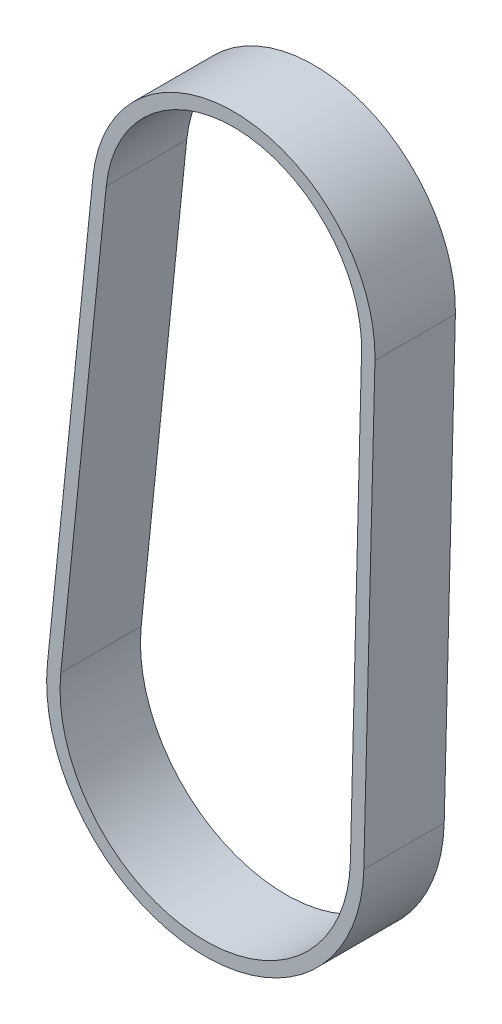
ISO-10303-21;
HEADER;
FILE_DESCRIPTION(('STEP AP214'),'2;1');
FILE_NAME('part.step','',(''),(''),'','','');
FILE_SCHEMA(('AUTOMOTIVE_DESIGN { 1 0 10303 214 1 1 1 1 }'));
ENDSEC;
DATA;
#1=APPLICATION_CONTEXT('core data for automotive mechanical design processes');
#2=APPLICATION_PROTOCOL_DEFINITION('international standard','automotive_design',2000,#1);
#3=PRODUCT_CONTEXT('',#1,'mechanical');
#4=PRODUCT('Part','Part','',(#3));
#5=PRODUCT_RELATED_PRODUCT_CATEGORY('part','',(#4));
#6=PRODUCT_DEFINITION_FORMATION('','',#4);
#7=PRODUCT_DEFINITION_CONTEXT('part definition',#1,'design');
#8=PRODUCT_DEFINITION('design','',#6,#7);
#9=PRODUCT_DEFINITION_SHAPE('','',#8);
#10=(LENGTH_UNIT() NAMED_UNIT(*) SI_UNIT(.MILLI.,.METRE.));
#11=(NAMED_UNIT(*) PLANE_ANGLE_UNIT() SI_UNIT($,.RADIAN.));
#12=(NAMED_UNIT(*) SI_UNIT($,.STERADIAN.) SOLID_ANGLE_UNIT());
#13=UNCERTAINTY_MEASURE_WITH_UNIT(LENGTH_MEASURE(1.E-05),#10,'distance_accuracy_value','');
#14=(GEOMETRIC_REPRESENTATION_CONTEXT(3) GLOBAL_UNCERTAINTY_ASSIGNED_CONTEXT((#13)) GLOBAL_UNIT_ASSIGNED_CONTEXT((#10,
#11,#12)) REPRESENTATION_CONTEXT('',''));
#15=CARTESIAN_POINT('',(0.,0.,0.));
#16=DIRECTION('',(0.,0.,1.));
#17=DIRECTION('',(1.,0.,0.));
#18=AXIS2_PLACEMENT_3D('',#15,#16,#17);
#19=CARTESIAN_POINT('',(-3.17499999999971,-49.8990909837134,-9.));
#20=DIRECTION('',(0.,0.,1.));
#21=DIRECTION('',(1.,0.,0.));
#22=AXIS2_PLACEMENT_3D('',#19,#20,#21);
#23=CYLINDRICAL_SURFACE('',#22,17.75);
#24=CARTESIAN_POINT('',(-3.17499999999971,-49.8990909837134,0.));
#25=DIRECTION('',(0.,0.,-1.));
#26=DIRECTION('',(-1.,0.,0.));
#27=AXIS2_PLACEMENT_3D('',#24,#25,#26);
#28=CIRCLE('',#27,17.75);
#29=CARTESIAN_POINT('',(-20.8326118377225,-48.0904328655741,0.));
#30=VERTEX_POINT('',#29);
#31=CARTESIAN_POINT('',(14.5694480361513,-50.3430097739636,0.));
#32=VERTEX_POINT('',#31);
#33=EDGE_CURVE('E164',#30,#32,#28,.F.);
#34=ORIENTED_EDGE('',*,*,#33,.F.);
#35=DIRECTION('',(0.,0.,1.));
#36=VECTOR('',#35,1.);
#37=CARTESIAN_POINT('',(-20.8326118377225,-48.0904328655741,-9.));
#38=LINE('',#37,#36);
#39=CARTESIAN_POINT('',(-20.8326118377225,-48.0904328655741,-9.));
#40=VERTEX_POINT('',#39);
#41=EDGE_CURVE('E12',#40,#30,#38,.T.);
#42=ORIENTED_EDGE('',*,*,#41,.F.);
#43=CARTESIAN_POINT('',(-3.17499999999971,-49.8990909837134,-9.));
#44=DIRECTION('',(0.,0.,-1.));
#45=DIRECTION('',(-1.,0.,0.));
#46=AXIS2_PLACEMENT_3D('',#43,#44,#45);
#47=CIRCLE('',#46,17.75);
#48=CARTESIAN_POINT('',(14.5694480361513,-50.3430097739636,-9.));
#49=VERTEX_POINT('',#48);
#50=EDGE_CURVE('E169',#40,#49,#47,.F.);
#51=ORIENTED_EDGE('',*,*,#50,.T.);
#52=DIRECTION('',(0.,0.,1.));
#53=VECTOR('',#52,1.);
#54=CARTESIAN_POINT('',(14.5694480361513,-50.3430097739636,-9.));
#55=LINE('',#54,#53);
#56=EDGE_CURVE('E66',#49,#32,#55,.T.);
#57=ORIENTED_EDGE('',*,*,#56,.T.);
#58=EDGE_LOOP('',(#34,#42,#51,#57));
#59=FACE_BOUND('',#58,.T.);
#60=ADVANCED_FACE('F69',(#59),#23,.T.);
#61=CARTESIAN_POINT('',(-20.8326118377225,-48.0904328655741,-9.));
#62=DIRECTION('',(-0.994795033111145,0.101896232007845,0.));
#63=DIRECTION('',(-0.101896232007845,-0.994795033111145,0.));
#64=AXIS2_PLACEMENT_3D('',#61,#62,#63);
#65=PLANE('',#64);
#66=DIRECTION('',(-0.101896232007845,-0.994795033111145,0.));
#67=VECTOR('',#66,1.);
#68=CARTESIAN_POINT('',(-20.8326118377225,-48.0904328655741,0.));
#69=LINE('',#68,#67);
#70=CARTESIAN_POINT('',(-15.7415817691281,1.61240035859561,0.));
#71=VERTEX_POINT('',#70);
#72=EDGE_CURVE('E173',#71,#30,#69,.T.);
#73=ORIENTED_EDGE('',*,*,#72,.F.);
#74=DIRECTION('',(0.,0.,1.));
#75=VECTOR('',#74,1.);
#76=CARTESIAN_POINT('',(-15.7415817691281,1.61240035859561,-9.));
#77=LINE('',#76,#75);
#78=CARTESIAN_POINT('',(-15.7415817691281,1.61240035859561,-9.));
#79=VERTEX_POINT('',#78);
#80=EDGE_CURVE('E71',#79,#71,#77,.T.);
#81=ORIENTED_EDGE('',*,*,#80,.F.);
#82=DIRECTION('',(-0.101896232007845,-0.994795033111145,0.));
#83=VECTOR('',#82,1.);
#84=CARTESIAN_POINT('',(-20.8326118377225,-48.0904328655741,-9.));
#85=LINE('',#84,#83);
#86=EDGE_CURVE('E177',#79,#40,#85,.T.);
#87=ORIENTED_EDGE('',*,*,#86,.T.);
#88=ORIENTED_EDGE('',*,*,#41,.T.);
#89=EDGE_LOOP('',(#73,#81,#87,#88));
#90=FACE_BOUND('',#89,.T.);
#91=ADVANCED_FACE('F201',(#90),#65,.T.);
#92=CARTESIAN_POINT('',(0.,0.,-9.));
#93=DIRECTION('',(0.,0.,1.));
#94=DIRECTION('',(1.,0.,0.));
#95=AXIS2_PLACEMENT_3D('',#92,#93,#94);
#96=CYLINDRICAL_SURFACE('',#95,15.8239448782706);
#97=CARTESIAN_POINT('',(0.,0.,0.));
#98=DIRECTION('',(0.,0.,-1.));
#99=DIRECTION('',(-1.,0.,0.));
#100=AXIS2_PLACEMENT_3D('',#97,#98,#99);
#101=CIRCLE('',#100,15.8239448782706);
#102=CARTESIAN_POINT('',(15.8189953588389,-0.395749096752025,0.));
#103=VERTEX_POINT('',#102);
#104=EDGE_CURVE('E190',#103,#71,#101,.F.);
#105=ORIENTED_EDGE('',*,*,#104,.F.);
#106=DIRECTION('',(0.,0.,1.));
#107=VECTOR('',#106,1.);
#108=CARTESIAN_POINT('',(15.8189953588389,-0.395749096752025,-9.));
#109=LINE('',#108,#107);
#110=CARTESIAN_POINT('',(15.8189953588389,-0.395749096752025,-9.));
#111=VERTEX_POINT('',#110);
#112=EDGE_CURVE('E195',#111,#103,#109,.T.);
#113=ORIENTED_EDGE('',*,*,#112,.F.);
#114=CARTESIAN_POINT('',(0.,0.,-9.));
#115=DIRECTION('',(0.,0.,-1.));
#116=DIRECTION('',(-1.,0.,0.));
#117=AXIS2_PLACEMENT_3D('',#114,#115,#116);
#118=CIRCLE('',#117,15.8239448782706);
#119=EDGE_CURVE('E176',#111,#79,#118,.F.);
#120=ORIENTED_EDGE('',*,*,#119,.T.);
#121=ORIENTED_EDGE('',*,*,#80,.T.);
#122=EDGE_LOOP('',(#105,#113,#120,#121));
#123=FACE_BOUND('',#122,.T.);
#124=ADVANCED_FACE('F209',(#123),#96,.T.);
#125=CARTESIAN_POINT('',(14.5694480361513,-50.3430097739636,-9.));
#126=DIRECTION('',(0.999687213304281,-0.025009509309873,0.));
#127=DIRECTION('',(0.025009509309873,0.999687213304281,0.));
#128=AXIS2_PLACEMENT_3D('',#125,#126,#127);
#129=PLANE('',#128);
#130=DIRECTION('',(0.025009509309873,0.999687213304281,0.));
#131=VECTOR('',#130,1.);
#132=CARTESIAN_POINT('',(14.5694480361513,-50.3430097739636,0.));
#133=LINE('',#132,#131);
#134=EDGE_CURVE('E183',#32,#103,#133,.T.);
#135=ORIENTED_EDGE('',*,*,#134,.F.);
#136=ORIENTED_EDGE('',*,*,#56,.F.);
#137=DIRECTION('',(0.025009509309873,0.999687213304281,0.));
#138=VECTOR('',#137,1.);
#139=CARTESIAN_POINT('',(14.5694480361513,-50.3430097739636,-9.));
#140=LINE('',#139,#138);
#141=EDGE_CURVE('E175',#49,#111,#140,.T.);
#142=ORIENTED_EDGE('',*,*,#141,.T.);
#143=ORIENTED_EDGE('',*,*,#112,.T.);
#144=EDGE_LOOP('',(#135,#136,#142,#143));
#145=FACE_BOUND('',#144,.T.);
#146=ADVANCED_FACE('F196',(#145),#129,.T.);
#147=CARTESIAN_POINT('',(-3.17499999999971,-49.8990909837134,-9.));
#148=DIRECTION('',(0.,0.,-1.));
#149=DIRECTION('',(-1.,0.,0.));
#150=AXIS2_PLACEMENT_3D('',#147,#148,#149);
#151=PLANE('',#150);
#152=CARTESIAN_POINT('',(-3.17499999999971,-49.8990909837134,-9.));
#153=DIRECTION('',(0.,0.,1.));
#154=DIRECTION('',(-1.,0.,0.));
#155=AXIS2_PLACEMENT_3D('',#152,#153,#154);
#156=CIRCLE('',#155,16.25);
#157=CARTESIAN_POINT('',(-19.3404192880558,-48.2432772135859,-9.));
#158=VERTEX_POINT('',#157);
#159=CARTESIAN_POINT('',(13.0699172161949,-50.3054955099988,-9.));
#160=VERTEX_POINT('',#159);
#161=EDGE_CURVE('E135',#158,#160,#156,.T.);
#162=ORIENTED_EDGE('',*,*,#161,.T.);
#163=DIRECTION('',(0.025009509309873,0.999687213304281,0.));
#164=VECTOR('',#163,1.);
#165=CARTESIAN_POINT('',(14.3194645388824,-0.358234832787216,-9.));
#166=LINE('',#165,#164);
#167=CARTESIAN_POINT('',(14.3194645388825,-0.358234832787227,-9.));
#168=VERTEX_POINT('',#167);
#169=EDGE_CURVE('E141',#160,#168,#166,.T.);
#170=ORIENTED_EDGE('',*,*,#169,.T.);
#171=CARTESIAN_POINT('',(0.,0.,-9.));
#172=DIRECTION('',(0.,0.,1.));
#173=DIRECTION('',(-1.,0.,0.));
#174=AXIS2_PLACEMENT_3D('',#171,#172,#173);
#175=CIRCLE('',#174,14.3239448782706);
#176=CARTESIAN_POINT('',(-14.2493892194614,1.45955601058384,-9.));
#177=VERTEX_POINT('',#176);
#178=EDGE_CURVE('E81',#168,#177,#175,.T.);
#179=ORIENTED_EDGE('',*,*,#178,.T.);
#180=DIRECTION('',(-0.101896232007845,-0.994795033111145,0.));
#181=VECTOR('',#180,1.);
#182=CARTESIAN_POINT('',(-19.3404192880558,-48.2432772135859,-9.));
#183=LINE('',#182,#181);
#184=EDGE_CURVE('E136',#177,#158,#183,.T.);
#185=ORIENTED_EDGE('',*,*,#184,.T.);
#186=EDGE_LOOP('',(#162,#170,#179,#185));
#187=FACE_BOUND('',#186,.T.);
#188=ORIENTED_EDGE('',*,*,#50,.F.);
#189=ORIENTED_EDGE('',*,*,#86,.F.);
#190=ORIENTED_EDGE('',*,*,#119,.F.);
#191=ORIENTED_EDGE('',*,*,#141,.F.);
#192=EDGE_LOOP('',(#188,#189,#190,#191));
#193=FACE_BOUND('',#192,.T.);
#194=ADVANCED_FACE('F150',(#187,#193),#151,.T.);
#195=CARTESIAN_POINT('',(-3.17499999999971,-49.8990909837134,0.));
#196=DIRECTION('',(0.,0.,-1.));
#197=DIRECTION('',(-1.,0.,0.));
#198=AXIS2_PLACEMENT_3D('',#195,#196,#197);
#199=PLANE('',#198);
#200=DIRECTION('',(0.025009509309873,0.999687213304281,0.));
#201=VECTOR('',#200,1.);
#202=CARTESIAN_POINT('',(14.3194645388824,-0.358234832787216,0.));
#203=LINE('',#202,#201);
#204=CARTESIAN_POINT('',(13.0699172161949,-50.3054955099988,0.));
#205=VERTEX_POINT('',#204);
#206=CARTESIAN_POINT('',(14.3194645388824,-0.358234832787216,0.));
#207=VERTEX_POINT('',#206);
#208=EDGE_CURVE('E159',#205,#207,#203,.T.);
#209=ORIENTED_EDGE('',*,*,#208,.F.);
#210=CARTESIAN_POINT('',(-3.17499999999971,-49.8990909837134,0.));
#211=DIRECTION('',(0.,0.,1.));
#212=DIRECTION('',(-1.,0.,0.));
#213=AXIS2_PLACEMENT_3D('',#210,#211,#212);
#214=CIRCLE('',#213,16.25);
#215=CARTESIAN_POINT('',(-19.3404192880558,-48.2432772135859,0.));
#216=VERTEX_POINT('',#215);
#217=EDGE_CURVE('E92',#216,#205,#214,.T.);
#218=ORIENTED_EDGE('',*,*,#217,.F.);
#219=DIRECTION('',(-0.101896232007845,-0.994795033111145,0.));
#220=VECTOR('',#219,1.);
#221=CARTESIAN_POINT('',(-19.3404192880558,-48.2432772135859,0.));
#222=LINE('',#221,#220);
#223=CARTESIAN_POINT('',(-14.2493892194614,1.45955601058384,0.));
#224=VERTEX_POINT('',#223);
#225=EDGE_CURVE('E147',#224,#216,#222,.T.);
#226=ORIENTED_EDGE('',*,*,#225,.F.);
#227=CARTESIAN_POINT('',(0.,0.,0.));
#228=DIRECTION('',(0.,0.,1.));
#229=DIRECTION('',(-1.,0.,0.));
#230=AXIS2_PLACEMENT_3D('',#227,#228,#229);
#231=CIRCLE('',#230,14.3239448782706);
#232=EDGE_CURVE('E152',#207,#224,#231,.T.);
#233=ORIENTED_EDGE('',*,*,#232,.F.);
#234=EDGE_LOOP('',(#209,#218,#226,#233));
#235=FACE_BOUND('',#234,.T.);
#236=ORIENTED_EDGE('',*,*,#33,.T.);
#237=ORIENTED_EDGE('',*,*,#134,.T.);
#238=ORIENTED_EDGE('',*,*,#104,.T.);
#239=ORIENTED_EDGE('',*,*,#72,.T.);
#240=EDGE_LOOP('',(#236,#237,#238,#239));
#241=FACE_BOUND('',#240,.T.);
#242=ADVANCED_FACE('F205',(#235,#241),#199,.F.);
#243=CARTESIAN_POINT('',(-3.17499999999971,-49.8990909837134,-9.));
#244=DIRECTION('',(0.,0.,1.));
#245=DIRECTION('',(1.,0.,0.));
#246=AXIS2_PLACEMENT_3D('',#243,#244,#245);
#247=CYLINDRICAL_SURFACE('',#246,16.25);
#248=ORIENTED_EDGE('',*,*,#217,.T.);
#249=DIRECTION('',(0.,0.,1.));
#250=VECTOR('',#249,1.);
#251=CARTESIAN_POINT('',(13.0699172161949,-50.3054955099988,-9.));
#252=LINE('',#251,#250);
#253=EDGE_CURVE('E127',#160,#205,#252,.T.);
#254=ORIENTED_EDGE('',*,*,#253,.F.);
#255=ORIENTED_EDGE('',*,*,#161,.F.);
#256=DIRECTION('',(0.,0.,1.));
#257=VECTOR('',#256,1.);
#258=CARTESIAN_POINT('',(-19.3404192880558,-48.2432772135859,-9.));
#259=LINE('',#258,#257);
#260=EDGE_CURVE('E161',#158,#216,#259,.T.);
#261=ORIENTED_EDGE('',*,*,#260,.T.);
#262=EDGE_LOOP('',(#248,#254,#255,#261));
#263=FACE_BOUND('',#262,.T.);
#264=ADVANCED_FACE('F134',(#263),#247,.F.);
#265=CARTESIAN_POINT('',(-19.3404192880558,-48.2432772135859,-9.));
#266=DIRECTION('',(-0.994795033111145,0.101896232007845,0.));
#267=DIRECTION('',(-0.101896232007845,-0.994795033111145,0.));
#268=AXIS2_PLACEMENT_3D('',#265,#266,#267);
#269=PLANE('',#268);
#270=ORIENTED_EDGE('',*,*,#225,.T.);
#271=ORIENTED_EDGE('',*,*,#260,.F.);
#272=ORIENTED_EDGE('',*,*,#184,.F.);
#273=DIRECTION('',(0.,0.,1.));
#274=VECTOR('',#273,1.);
#275=CARTESIAN_POINT('',(-14.2493892194614,1.45955601058384,-9.));
#276=LINE('',#275,#274);
#277=EDGE_CURVE('E168',#177,#224,#276,.T.);
#278=ORIENTED_EDGE('',*,*,#277,.T.);
#279=EDGE_LOOP('',(#270,#271,#272,#278));
#280=FACE_BOUND('',#279,.T.);
#281=ADVANCED_FACE('F264',(#280),#269,.F.);
#282=CARTESIAN_POINT('',(0.,0.,-9.));
#283=DIRECTION('',(0.,0.,1.));
#284=DIRECTION('',(1.,0.,0.));
#285=AXIS2_PLACEMENT_3D('',#282,#283,#284);
#286=CYLINDRICAL_SURFACE('',#285,14.3239448782706);
#287=ORIENTED_EDGE('',*,*,#232,.T.);
#288=ORIENTED_EDGE('',*,*,#277,.F.);
#289=ORIENTED_EDGE('',*,*,#178,.F.);
#290=DIRECTION('',(0.,0.,1.));
#291=VECTOR('',#290,1.);
#292=CARTESIAN_POINT('',(14.3194645388824,-0.358234832787216,-9.));
#293=LINE('',#292,#291);
#294=EDGE_CURVE('E139',#168,#207,#293,.T.);
#295=ORIENTED_EDGE('',*,*,#294,.T.);
#296=EDGE_LOOP('',(#287,#288,#289,#295));
#297=FACE_BOUND('',#296,.T.);
#298=ADVANCED_FACE('F272',(#297),#286,.F.);
#299=CARTESIAN_POINT('',(14.3194645388824,-0.358234832787216,-9.));
#300=DIRECTION('',(0.999687213304281,-0.025009509309873,0.));
#301=DIRECTION('',(0.025009509309873,0.999687213304281,0.));
#302=AXIS2_PLACEMENT_3D('',#299,#300,#301);
#303=PLANE('',#302);
#304=ORIENTED_EDGE('',*,*,#208,.T.);
#305=ORIENTED_EDGE('',*,*,#294,.F.);
#306=ORIENTED_EDGE('',*,*,#169,.F.);
#307=ORIENTED_EDGE('',*,*,#253,.T.);
#308=EDGE_LOOP('',(#304,#305,#306,#307));
#309=FACE_BOUND('',#308,.T.);
#310=ADVANCED_FACE('F144',(#309),#303,.F.);
#311=CLOSED_SHELL('',(#60,#91,#124,#146,#194,#242,#264,#281,#298,#310));
#312=MANIFOLD_SOLID_BREP('B2',#311);
#313=ADVANCED_BREP_SHAPE_REPRESENTATION('',(#18,#312),#14);
#314=SHAPE_DEFINITION_REPRESENTATION(#9,#313);
ENDSEC;
END-ISO-10303-21;
